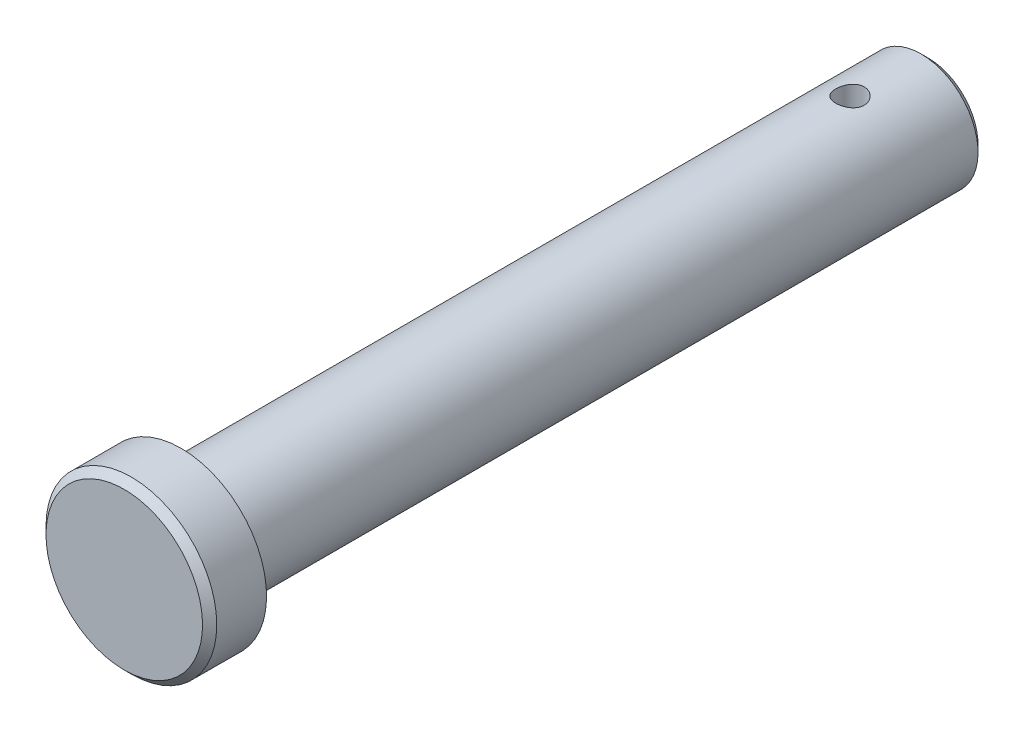
ISO-10303-21;
HEADER;
FILE_DESCRIPTION(('STEP AP214'),'2;1');
FILE_NAME('part.step','',(''),(''),'','','');
FILE_SCHEMA(('AUTOMOTIVE_DESIGN { 1 0 10303 214 1 1 1 1 }'));
ENDSEC;
DATA;
#1=APPLICATION_CONTEXT('core data for automotive mechanical design processes');
#2=APPLICATION_PROTOCOL_DEFINITION('international standard','automotive_design',2000,#1);
#3=PRODUCT_CONTEXT('',#1,'mechanical');
#4=PRODUCT('Part','Part','',(#3));
#5=PRODUCT_RELATED_PRODUCT_CATEGORY('part','',(#4));
#6=PRODUCT_DEFINITION_FORMATION('','',#4);
#7=PRODUCT_DEFINITION_CONTEXT('part definition',#1,'design');
#8=PRODUCT_DEFINITION('design','',#6,#7);
#9=PRODUCT_DEFINITION_SHAPE('','',#8);
#10=(LENGTH_UNIT() NAMED_UNIT(*) SI_UNIT(.MILLI.,.METRE.));
#11=(NAMED_UNIT(*) PLANE_ANGLE_UNIT() SI_UNIT($,.RADIAN.));
#12=(NAMED_UNIT(*) SI_UNIT($,.STERADIAN.) SOLID_ANGLE_UNIT());
#13=UNCERTAINTY_MEASURE_WITH_UNIT(LENGTH_MEASURE(1.E-05),#10,'distance_accuracy_value','');
#14=(GEOMETRIC_REPRESENTATION_CONTEXT(3) GLOBAL_UNCERTAINTY_ASSIGNED_CONTEXT((#13)) GLOBAL_UNIT_ASSIGNED_CONTEXT((#10,
#11,#12)) REPRESENTATION_CONTEXT('',''));
#15=CARTESIAN_POINT('',(0.,0.,0.));
#16=DIRECTION('',(0.,0.,1.));
#17=DIRECTION('',(1.,0.,0.));
#18=AXIS2_PLACEMENT_3D('',#15,#16,#17);
#19=CARTESIAN_POINT('',(0.,0.,0.));
#20=DIRECTION('',(0.,0.,1.));
#21=DIRECTION('',(0.,-1.,0.));
#22=AXIS2_PLACEMENT_3D('',#19,#20,#21);
#23=PLANE('',#22);
#24=CARTESIAN_POINT('',(0.,0.,0.));
#25=DIRECTION('',(0.,0.,1.));
#26=DIRECTION('',(0.,-1.,0.));
#27=AXIS2_PLACEMENT_3D('',#24,#25,#26);
#28=CIRCLE('',#27,11.);
#29=CARTESIAN_POINT('',(0.,-11.,0.));
#30=VERTEX_POINT('',#29);
#31=EDGE_CURVE('E10',#30,#30,#28,.T.);
#32=ORIENTED_EDGE('',*,*,#31,.T.);
#33=EDGE_LOOP('',(#32));
#34=FACE_BOUND('',#33,.T.);
#35=ADVANCED_FACE('F39',(#34),#23,.T.);
#36=CARTESIAN_POINT('',(0.,0.,-113.));
#37=DIRECTION('',(0.,0.,-1.));
#38=DIRECTION('',(0.,1.,0.));
#39=AXIS2_PLACEMENT_3D('',#36,#37,#38);
#40=CYLINDRICAL_SURFACE('',#39,12.);
#41=CARTESIAN_POINT('',(0.,0.,-1.));
#42=DIRECTION('',(0.,0.,1.));
#43=DIRECTION('',(0.,-1.,0.));
#44=AXIS2_PLACEMENT_3D('',#41,#42,#43);
#45=CIRCLE('',#44,12.);
#46=CARTESIAN_POINT('',(0.,-12.,-1.));
#47=VERTEX_POINT('',#46);
#48=EDGE_CURVE('E52',#47,#47,#45,.F.);
#49=ORIENTED_EDGE('',*,*,#48,.T.);
#50=EDGE_LOOP('',(#49));
#51=FACE_BOUND('',#50,.T.);
#52=CARTESIAN_POINT('',(0.,0.,-7.99999999999999));
#53=DIRECTION('',(0.,0.,-1.));
#54=DIRECTION('',(0.,1.,0.));
#55=AXIS2_PLACEMENT_3D('',#52,#53,#54);
#56=CIRCLE('',#55,12.);
#57=CARTESIAN_POINT('',(0.,12.,-7.99999999999999));
#58=VERTEX_POINT('',#57);
#59=EDGE_CURVE('E110',#58,#58,#56,.T.);
#60=ORIENTED_EDGE('',*,*,#59,.F.);
#61=EDGE_LOOP('',(#60));
#62=FACE_BOUND('',#61,.T.);
#63=ADVANCED_FACE('F90',(#51,#62),#40,.T.);
#64=CARTESIAN_POINT('',(0.,12.,-8.));
#65=DIRECTION('',(0.,0.,-1.));
#66=DIRECTION('',(0.,1.,0.));
#67=AXIS2_PLACEMENT_3D('',#64,#65,#66);
#68=PLANE('',#67);
#69=ORIENTED_EDGE('',*,*,#59,.T.);
#70=EDGE_LOOP('',(#69));
#71=FACE_BOUND('',#70,.T.);
#72=CARTESIAN_POINT('',(0.,0.,-7.99999999999999));
#73=DIRECTION('',(0.,0.,-1.));
#74=DIRECTION('',(0.,1.,0.));
#75=AXIS2_PLACEMENT_3D('',#72,#73,#74);
#76=CIRCLE('',#75,8.);
#77=CARTESIAN_POINT('',(0.,8.,-7.99999999999999));
#78=VERTEX_POINT('',#77);
#79=EDGE_CURVE('E109',#78,#78,#76,.T.);
#80=ORIENTED_EDGE('',*,*,#79,.F.);
#81=EDGE_LOOP('',(#80));
#82=FACE_BOUND('',#81,.T.);
#83=ADVANCED_FACE('F81',(#71,#82),#68,.T.);
#84=CARTESIAN_POINT('',(0.,0.,-113.));
#85=DIRECTION('',(0.,0.,-1.));
#86=DIRECTION('',(0.,1.,0.));
#87=AXIS2_PLACEMENT_3D('',#84,#85,#86);
#88=CYLINDRICAL_SURFACE('',#87,8.);
#89=CARTESIAN_POINT('',(0.,8.,-100.));
#90=CARTESIAN_POINT('',(0.110501451559641,7.9999981315735,-100.000003100984));
#91=CARTESIAN_POINT('',(0.22103754377435,7.99768770842435,-100.009188734365));
#92=CARTESIAN_POINT('',(0.438941765027375,7.98869485106526,-100.045633535076));
#93=CARTESIAN_POINT('',(0.546308062494317,7.98200993893302,-100.07290294605));
#94=CARTESIAN_POINT('',(0.754694496243433,7.96500835109377,-100.144585671283));
#95=CARTESIAN_POINT('',(0.855722084573334,7.95469603789411,-100.188978398287));
#96=CARTESIAN_POINT('',(1.04889617587257,7.93153791743495,-100.293575186726));
#97=CARTESIAN_POINT('',(1.14104237913168,7.91869202472209,-100.353779781492));
#98=CARTESIAN_POINT('',(1.31573590306788,7.89156551455591,-100.489601052872));
#99=CARTESIAN_POINT('',(1.39807425341474,7.87726276197502,-100.565482099945));
#100=CARTESIAN_POINT('',(1.54899856960442,7.84898160157248,-100.729936273212));
#101=CARTESIAN_POINT('',(1.61758298259892,7.83500323053157,-100.818510830596));
#102=CARTESIAN_POINT('',(1.74003539039863,7.80873034264225,-101.007460302316));
#103=CARTESIAN_POINT('',(1.79366962123352,7.79646392619748,-101.107990974412));
#104=CARTESIAN_POINT('',(1.88319587806766,7.77532659757355,-101.316997882213));
#105=CARTESIAN_POINT('',(1.91909074058685,7.76645514259225,-101.425472844443));
#106=CARTESIAN_POINT('',(1.97140644907302,7.75333968928431,-101.644991330936));
#107=CARTESIAN_POINT('',(1.98820302444274,7.74900654662682,-101.755939861384));
#108=CARTESIAN_POINT('',(2.00301570008854,7.74519149946122,-101.979158091999));
#109=CARTESIAN_POINT('',(2.00103485575748,7.74570880570571,-102.091427574256));
#110=CARTESIAN_POINT('',(1.97864869951961,7.75145607355756,-102.311221076994));
#111=CARTESIAN_POINT('',(1.95869112025418,7.75657150676392,-102.418794161954));
#112=CARTESIAN_POINT('',(1.90163224920399,7.77075612894759,-102.629014734548));
#113=CARTESIAN_POINT('',(1.86452973609253,7.77982559958985,-102.731661870705));
#114=CARTESIAN_POINT('',(1.77385263724958,7.80100151874212,-102.930317355003));
#115=CARTESIAN_POINT('',(1.72011555631056,7.81313769959755,-103.026248229053));
#116=CARTESIAN_POINT('',(1.59780836801993,7.83906281127988,-103.207891613009));
#117=CARTESIAN_POINT('',(1.52923566507845,7.85285203112837,-103.293602330756));
#118=CARTESIAN_POINT('',(1.37688456624163,7.88101174053189,-103.454938154259));
#119=CARTESIAN_POINT('',(1.29272834422115,7.89538759304001,-103.530205986748));
#120=CARTESIAN_POINT('',(1.11281589000494,7.92274620771675,-103.665628323285));
#121=CARTESIAN_POINT('',(1.0170593036106,7.93572892732543,-103.725782365685));
#122=CARTESIAN_POINT('',(0.816154518241861,7.9589030945892,-103.829400781633));
#123=CARTESIAN_POINT('',(0.710975190944834,7.96908480170303,-103.872807120339));
#124=CARTESIAN_POINT('',(0.494501344190509,7.98543889321888,-103.941223074279));
#125=CARTESIAN_POINT('',(0.383207998867311,7.99161204452374,-103.966236208558));
#126=CARTESIAN_POINT('',(0.160719960520034,7.999139990285,-103.996610087412));
#127=CARTESIAN_POINT('',(0.0495956266509452,8.00061404677705,-104.0024573681));
#128=CARTESIAN_POINT('',(-0.172043833068677,7.99891739752601,-103.995667997259));
#129=CARTESIAN_POINT('',(-0.282559012859458,7.99574710989129,-103.983033009601));
#130=CARTESIAN_POINT('',(-0.498152358368654,7.98519441503143,-103.940038788811));
#131=CARTESIAN_POINT('',(-0.603286825291672,7.97787512247749,-103.909944982031));
#132=CARTESIAN_POINT('',(-0.807009723270014,7.95984942178846,-103.833190554629));
#133=CARTESIAN_POINT('',(-0.905597492043511,7.94914267159856,-103.786528260916));
#134=CARTESIAN_POINT('',(-1.09536417923979,7.92524410568414,-103.677018494834));
#135=CARTESIAN_POINT('',(-1.18638058911444,7.91201156489243,-103.613898516804));
#136=CARTESIAN_POINT('',(-1.35670215152433,7.88459345583226,-103.473613454937));
#137=CARTESIAN_POINT('',(-1.43600527863068,7.87040772335606,-103.396445947177));
#138=CARTESIAN_POINT('',(-1.58265409076364,7.84225275947695,-103.227997385541));
#139=CARTESIAN_POINT('',(-1.6496584901627,7.82829738916375,-103.136416395997));
#140=CARTESIAN_POINT('',(-1.76734767868359,7.80257171169652,-102.943023154046));
#141=CARTESIAN_POINT('',(-1.81803319221058,7.79080130756035,-102.841211356054));
#142=CARTESIAN_POINT('',(-1.90126856081238,7.77090792979554,-102.630792370116));
#143=CARTESIAN_POINT('',(-1.93392586220541,7.76276340389208,-102.522229828875));
#144=CARTESIAN_POINT('',(-1.98046087993837,7.75102325453578,-102.300920482815));
#145=CARTESIAN_POINT('',(-1.99434270330488,7.74742663626582,-102.188174598623));
#146=CARTESIAN_POINT('',(-2.00271812044533,7.74526534938609,-101.965171968193));
#147=CARTESIAN_POINT('',(-1.99775719704016,7.74655910304352,-101.854936753167));
#148=CARTESIAN_POINT('',(-1.96983637108383,7.7537054534379,-101.636928148443));
#149=CARTESIAN_POINT('',(-1.94687683024903,7.75955795855809,-101.529154709315));
#150=CARTESIAN_POINT('',(-1.88390842592373,7.77508347576963,-101.319722054579));
#151=CARTESIAN_POINT('',(-1.84400187290717,7.78473353648412,-101.21803025968));
#152=CARTESIAN_POINT('',(-1.7483532181401,7.80677007633105,-101.022712823048));
#153=CARTESIAN_POINT('',(-1.69260892004559,7.81915693494364,-100.929088302417));
#154=CARTESIAN_POINT('',(-1.56515699818286,7.84567512351349,-100.749927161331));
#155=CARTESIAN_POINT('',(-1.49307088388301,7.85984353109009,-100.664665235435));
#156=CARTESIAN_POINT('',(-1.33571916158632,7.88810702995048,-100.507270606939));
#157=CARTESIAN_POINT('',(-1.2504504283482,7.90220210302746,-100.435141026516));
#158=CARTESIAN_POINT('',(-1.06729011560345,7.92903540863551,-100.304784921914));
#159=CARTESIAN_POINT('',(-0.969197896421848,7.94174444487824,-100.246833848438));
#160=CARTESIAN_POINT('',(-0.764354746013968,7.96406566633491,-100.148336716079));
#161=CARTESIAN_POINT('',(-0.65761008458232,7.97368006933042,-100.107778185802));
#162=CARTESIAN_POINT('',(-0.459213670991296,7.98730746087389,-100.05123755956));
#163=CARTESIAN_POINT('',(-0.36850689454409,7.99203446736921,-100.032065009262));
#164=CARTESIAN_POINT('',(-0.185208095381709,7.99838140309265,-100.006445408504));
#165=CARTESIAN_POINT('',(-0.0926162149901544,8.00000156601193,-99.9999974009263));
#166=CARTESIAN_POINT('',(0.,8.,-100.));
#167=B_SPLINE_CURVE_WITH_KNOTS('',3,(#89,#90,#91,#92,#93,#94,#95,#96,#97,#98,#99,#100,#101,#102,
#103,#104,#105,#106,#107,#108,#109,#110,#111,#112,#113,#114,#115,#116,#117,#118,#119,#120,#121,
#122,#123,#124,#125,#126,#127,#128,#129,#130,#131,#132,#133,#134,#135,#136,#137,#138,#139,#140,
#141,#142,#143,#144,#145,#146,#147,#148,#149,#150,#151,#152,#153,#154,#155,#156,#157,#158,#159,
#160,#161,#162,#163,#164,#165,#166),.UNSPECIFIED.,.T.,.F.,(4,2,2,2,2,2,2,2,2,2,2,2,2,2,2,2,2,2,
2,2,2,2,2,2,2,2,2,2,2,2,2,2,2,2,2,2,2,2,4),(0.,0.331164949962517,0.662517650351865,
0.993473203048136,1.32443992022577,1.66152580582851,1.99864972773416,2.34078196727742,
2.68285948225824,3.01808393468092,3.35325384154689,3.68029996013784,4.00736937959146,
4.33774037169599,4.66816921119311,5.00802001296453,5.34788119415423,5.6889097201658,
6.02987298255952,6.36211078603463,6.69431868154751,7.02160366023144,7.34892169767481,
7.68204783424896,8.01523150681786,8.35659345610394,8.69794025003771,9.03723006156474,
9.3764456434097,9.70591707202576,10.0353818794581,10.3628853408369,10.6904342418696,
11.0265276855097,11.3627009303165,11.7049624733721,12.0469781843289,12.3245632392729,
12.6021274139515),.UNSPECIFIED.);
#168=CARTESIAN_POINT('',(0.,8.,-100.));
#169=VERTEX_POINT('',#168);
#170=EDGE_CURVE('E42',#169,#169,#167,.T.);
#171=ORIENTED_EDGE('',*,*,#170,.F.);
#172=EDGE_LOOP('',(#171));
#173=FACE_BOUND('',#172,.T.);
#174=CARTESIAN_POINT('',(0.,-8.,-100.));
#175=CARTESIAN_POINT('',(-0.110501451559641,-7.99999813157349,-100.000003100984));
#176=CARTESIAN_POINT('',(-0.22103754377435,-7.99768770842435,-100.009188734365));
#177=CARTESIAN_POINT('',(-0.438941765027375,-7.98869485106526,-100.045633535076));
#178=CARTESIAN_POINT('',(-0.546308062494317,-7.98200993893301,-100.07290294605));
#179=CARTESIAN_POINT('',(-0.754694496243433,-7.96500835109376,-100.144585671283));
#180=CARTESIAN_POINT('',(-0.855722084573334,-7.95469603789411,-100.188978398287));
#181=CARTESIAN_POINT('',(-1.04889617587257,-7.93153791743495,-100.293575186726));
#182=CARTESIAN_POINT('',(-1.14104237913168,-7.91869202472209,-100.353779781492));
#183=CARTESIAN_POINT('',(-1.31573590306788,-7.89156551455591,-100.489601052872));
#184=CARTESIAN_POINT('',(-1.39807425341474,-7.87726276197501,-100.565482099945));
#185=CARTESIAN_POINT('',(-1.54899856960442,-7.84898160157248,-100.729936273212));
#186=CARTESIAN_POINT('',(-1.61758298259892,-7.83500323053157,-100.818510830596));
#187=CARTESIAN_POINT('',(-1.74003539039863,-7.80873034264224,-101.007460302316));
#188=CARTESIAN_POINT('',(-1.79366962123352,-7.79646392619748,-101.107990974412));
#189=CARTESIAN_POINT('',(-1.88319587806766,-7.77532659757355,-101.316997882213));
#190=CARTESIAN_POINT('',(-1.91909074058685,-7.76645514259224,-101.425472844443));
#191=CARTESIAN_POINT('',(-1.97140644907302,-7.7533396892843,-101.644991330936));
#192=CARTESIAN_POINT('',(-1.98820302444274,-7.74900654662681,-101.755939861384));
#193=CARTESIAN_POINT('',(-2.00301570008854,-7.74519149946122,-101.979158091999));
#194=CARTESIAN_POINT('',(-2.00103485575748,-7.74570880570571,-102.091427574256));
#195=CARTESIAN_POINT('',(-1.97864869951961,-7.75145607355756,-102.311221076994));
#196=CARTESIAN_POINT('',(-1.95869112025418,-7.75657150676391,-102.418794161954));
#197=CARTESIAN_POINT('',(-1.90163224920399,-7.77075612894758,-102.629014734548));
#198=CARTESIAN_POINT('',(-1.86452973609253,-7.77982559958985,-102.731661870705));
#199=CARTESIAN_POINT('',(-1.77385263724958,-7.80100151874212,-102.930317355003));
#200=CARTESIAN_POINT('',(-1.72011555631056,-7.81313769959754,-103.026248229053));
#201=CARTESIAN_POINT('',(-1.59780836801993,-7.83906281127988,-103.207891613009));
#202=CARTESIAN_POINT('',(-1.52923566507845,-7.85285203112837,-103.293602330756));
#203=CARTESIAN_POINT('',(-1.37688456624163,-7.88101174053188,-103.454938154259));
#204=CARTESIAN_POINT('',(-1.29272834422115,-7.89538759304001,-103.530205986748));
#205=CARTESIAN_POINT('',(-1.11281589000494,-7.92274620771675,-103.665628323285));
#206=CARTESIAN_POINT('',(-1.0170593036106,-7.93572892732543,-103.725782365685));
#207=CARTESIAN_POINT('',(-0.816154518241861,-7.9589030945892,-103.829400781633));
#208=CARTESIAN_POINT('',(-0.710975190944834,-7.96908480170303,-103.872807120339));
#209=CARTESIAN_POINT('',(-0.494501344190509,-7.98543889321888,-103.941223074279));
#210=CARTESIAN_POINT('',(-0.383207998867311,-7.99161204452373,-103.966236208558));
#211=CARTESIAN_POINT('',(-0.160719960520034,-7.999139990285,-103.996610087412));
#212=CARTESIAN_POINT('',(-0.0495956266509452,-8.00061404677705,-104.0024573681));
#213=CARTESIAN_POINT('',(0.172043833068677,-7.99891739752601,-103.995667997259));
#214=CARTESIAN_POINT('',(0.282559012859458,-7.99574710989128,-103.983033009601));
#215=CARTESIAN_POINT('',(0.498152358368654,-7.98519441503143,-103.940038788811));
#216=CARTESIAN_POINT('',(0.603286825291672,-7.97787512247748,-103.909944982031));
#217=CARTESIAN_POINT('',(0.807009723270014,-7.95984942178845,-103.833190554629));
#218=CARTESIAN_POINT('',(0.905597492043511,-7.94914267159856,-103.786528260916));
#219=CARTESIAN_POINT('',(1.09536417923979,-7.92524410568414,-103.677018494834));
#220=CARTESIAN_POINT('',(1.18638058911444,-7.91201156489243,-103.613898516804));
#221=CARTESIAN_POINT('',(1.35670215152433,-7.88459345583226,-103.473613454937));
#222=CARTESIAN_POINT('',(1.43600527863068,-7.87040772335606,-103.396445947177));
#223=CARTESIAN_POINT('',(1.58265409076364,-7.84225275947695,-103.227997385541));
#224=CARTESIAN_POINT('',(1.6496584901627,-7.82829738916374,-103.136416395997));
#225=CARTESIAN_POINT('',(1.76734767868359,-7.80257171169651,-102.943023154046));
#226=CARTESIAN_POINT('',(1.81803319221058,-7.79080130756035,-102.841211356054));
#227=CARTESIAN_POINT('',(1.90126856081238,-7.77090792979553,-102.630792370116));
#228=CARTESIAN_POINT('',(1.93392586220541,-7.76276340389207,-102.522229828875));
#229=CARTESIAN_POINT('',(1.98046087993837,-7.75102325453578,-102.300920482815));
#230=CARTESIAN_POINT('',(1.99434270330488,-7.74742663626581,-102.188174598623));
#231=CARTESIAN_POINT('',(2.00271812044533,-7.74526534938609,-101.965171968193));
#232=CARTESIAN_POINT('',(1.99775719704016,-7.74655910304351,-101.854936753167));
#233=CARTESIAN_POINT('',(1.96983637108383,-7.7537054534379,-101.636928148443));
#234=CARTESIAN_POINT('',(1.94687683024903,-7.75955795855809,-101.529154709315));
#235=CARTESIAN_POINT('',(1.88390842592373,-7.77508347576963,-101.319722054579));
#236=CARTESIAN_POINT('',(1.84400187290717,-7.78473353648412,-101.21803025968));
#237=CARTESIAN_POINT('',(1.7483532181401,-7.80677007633104,-101.022712823048));
#238=CARTESIAN_POINT('',(1.69260892004559,-7.81915693494364,-100.929088302417));
#239=CARTESIAN_POINT('',(1.56515699818286,-7.84567512351349,-100.749927161331));
#240=CARTESIAN_POINT('',(1.49307088388301,-7.85984353109009,-100.664665235435));
#241=CARTESIAN_POINT('',(1.33571916158632,-7.88810702995047,-100.507270606939));
#242=CARTESIAN_POINT('',(1.2504504283482,-7.90220210302746,-100.435141026516));
#243=CARTESIAN_POINT('',(1.06729011560345,-7.9290354086355,-100.304784921914));
#244=CARTESIAN_POINT('',(0.969197896421848,-7.94174444487824,-100.246833848438));
#245=CARTESIAN_POINT('',(0.764354746013968,-7.96406566633491,-100.148336716079));
#246=CARTESIAN_POINT('',(0.65761008458232,-7.97368006933042,-100.107778185802));
#247=CARTESIAN_POINT('',(0.459213670991296,-7.98730746087388,-100.05123755956));
#248=CARTESIAN_POINT('',(0.36850689454409,-7.9920344673692,-100.032065009262));
#249=CARTESIAN_POINT('',(0.185208095381709,-7.99838140309264,-100.006445408504));
#250=CARTESIAN_POINT('',(0.0926162149901544,-8.00000156601192,-99.9999974009263));
#251=CARTESIAN_POINT('',(0.,-8.,-100.));
#252=B_SPLINE_CURVE_WITH_KNOTS('',3,(#174,#175,#176,#177,#178,#179,#180,#181,#182,#183,#184,
#185,#186,#187,#188,#189,#190,#191,#192,#193,#194,#195,#196,#197,#198,#199,#200,#201,#202,#203,
#204,#205,#206,#207,#208,#209,#210,#211,#212,#213,#214,#215,#216,#217,#218,#219,#220,#221,#222,
#223,#224,#225,#226,#227,#228,#229,#230,#231,#232,#233,#234,#235,#236,#237,#238,#239,#240,#241,
#242,#243,#244,#245,#246,#247,#248,#249,#250,#251),.UNSPECIFIED.,.T.,.F.,(4,2,2,2,2,2,2,2,2,2,2,
2,2,2,2,2,2,2,2,2,2,2,2,2,2,2,2,2,2,2,2,2,2,2,2,2,2,2,4),(0.,0.331164949962517,
0.662517650351865,0.993473203048136,1.32443992022577,1.66152580582851,1.99864972773416,
2.34078196727742,2.68285948225824,3.01808393468092,3.35325384154689,3.68029996013784,
4.00736937959146,4.33774037169599,4.66816921119311,5.00802001296453,5.34788119415423,
5.6889097201658,6.02987298255952,6.36211078603463,6.69431868154751,7.02160366023144,
7.34892169767481,7.68204783424896,8.01523150681786,8.35659345610394,8.69794025003771,
9.03723006156474,9.3764456434097,9.70591707202576,10.0353818794581,10.3628853408369,
10.6904342418696,11.0265276855097,11.3627009303165,11.7049624733721,12.0469781843289,
12.3245632392729,12.6021274139515),.UNSPECIFIED.);
#253=CARTESIAN_POINT('',(0.,-8.,-100.));
#254=VERTEX_POINT('',#253);
#255=EDGE_CURVE('E62',#254,#254,#252,.T.);
#256=ORIENTED_EDGE('',*,*,#255,.F.);
#257=EDGE_LOOP('',(#256));
#258=FACE_BOUND('',#257,.T.);
#259=CARTESIAN_POINT('',(0.,0.,-112.));
#260=DIRECTION('',(0.,0.,-1.));
#261=DIRECTION('',(0.,1.,0.));
#262=AXIS2_PLACEMENT_3D('',#259,#260,#261);
#263=CIRCLE('',#262,8.);
#264=CARTESIAN_POINT('',(0.,8.,-112.));
#265=VERTEX_POINT('',#264);
#266=EDGE_CURVE('E59',#265,#265,#263,.F.);
#267=ORIENTED_EDGE('',*,*,#266,.T.);
#268=EDGE_LOOP('',(#267));
#269=FACE_BOUND('',#268,.T.);
#270=ORIENTED_EDGE('',*,*,#79,.T.);
#271=EDGE_LOOP('',(#270));
#272=FACE_BOUND('',#271,.T.);
#273=ADVANCED_FACE('F68',(#173,#258,#269,#272),#88,.T.);
#274=CARTESIAN_POINT('',(0.,8.,-113.));
#275=DIRECTION('',(0.,0.,-1.));
#276=DIRECTION('',(0.,1.,0.));
#277=AXIS2_PLACEMENT_3D('',#274,#275,#276);
#278=PLANE('',#277);
#279=CARTESIAN_POINT('',(0.,0.,-113.));
#280=DIRECTION('',(0.,0.,-1.));
#281=DIRECTION('',(0.,1.,0.));
#282=AXIS2_PLACEMENT_3D('',#279,#280,#281);
#283=CIRCLE('',#282,7.00000000000001);
#284=CARTESIAN_POINT('',(0.,7.00000000000001,-113.));
#285=VERTEX_POINT('',#284);
#286=EDGE_CURVE('E114',#285,#285,#283,.T.);
#287=ORIENTED_EDGE('',*,*,#286,.T.);
#288=EDGE_LOOP('',(#287));
#289=FACE_BOUND('',#288,.T.);
#290=ADVANCED_FACE('F74',(#289),#278,.T.);
#291=CARTESIAN_POINT('',(0.,0.,-113.));
#292=DIRECTION('',(0.,0.,1.));
#293=DIRECTION('',(0.,-1.,0.));
#294=AXIS2_PLACEMENT_3D('',#291,#292,#293);
#295=CONICAL_SURFACE('',#294,7.00000000000001,0.785398163397445);
#296=ORIENTED_EDGE('',*,*,#266,.F.);
#297=EDGE_LOOP('',(#296));
#298=FACE_BOUND('',#297,.T.);
#299=ORIENTED_EDGE('',*,*,#286,.F.);
#300=EDGE_LOOP('',(#299));
#301=FACE_BOUND('',#300,.T.);
#302=ADVANCED_FACE('F80',(#298,#301),#295,.T.);
#303=CARTESIAN_POINT('',(0.,0.,-1.));
#304=DIRECTION('',(0.,0.,-1.));
#305=DIRECTION('',(0.,1.,0.));
#306=AXIS2_PLACEMENT_3D('',#303,#304,#305);
#307=CONICAL_SURFACE('',#306,12.,0.78539816339745);
#308=ORIENTED_EDGE('',*,*,#31,.F.);
#309=EDGE_LOOP('',(#308));
#310=FACE_BOUND('',#309,.T.);
#311=ORIENTED_EDGE('',*,*,#48,.F.);
#312=EDGE_LOOP('',(#311));
#313=FACE_BOUND('',#312,.T.);
#314=ADVANCED_FACE('F45',(#310,#313),#307,.T.);
#315=CARTESIAN_POINT('',(0.,-12.,-102.));
#316=DIRECTION('',(0.,1.,0.));
#317=DIRECTION('',(0.,0.,1.));
#318=AXIS2_PLACEMENT_3D('',#315,#316,#317);
#319=CYLINDRICAL_SURFACE('',#318,2.);
#320=ORIENTED_EDGE('',*,*,#170,.T.);
#321=EDGE_LOOP('',(#320));
#322=FACE_BOUND('',#321,.T.);
#323=ORIENTED_EDGE('',*,*,#255,.T.);
#324=EDGE_LOOP('',(#323));
#325=FACE_BOUND('',#324,.T.);
#326=ADVANCED_FACE('F66',(#322,#325),#319,.F.);
#327=CLOSED_SHELL('',(#35,#63,#83,#273,#290,#302,#314,#326));
#328=MANIFOLD_SOLID_BREP('B2',#327);
#329=ADVANCED_BREP_SHAPE_REPRESENTATION('',(#18,#328),#14);
#330=SHAPE_DEFINITION_REPRESENTATION(#9,#329);
ENDSEC;
END-ISO-10303-21;
